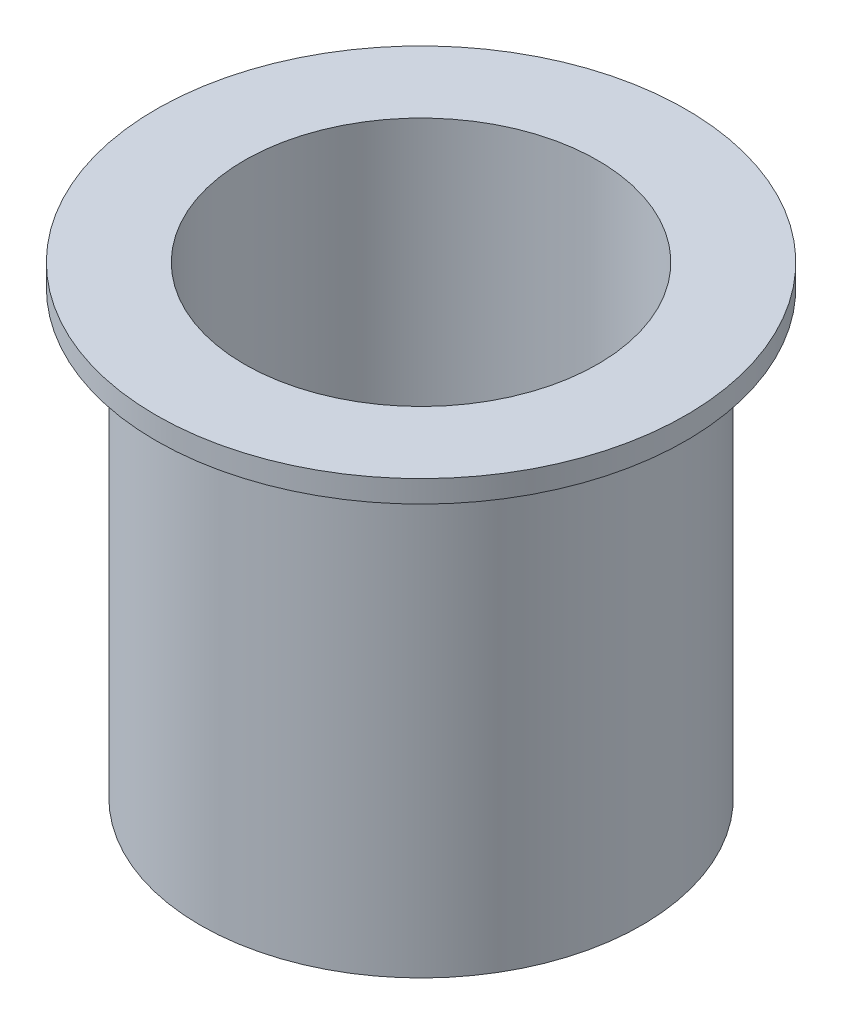
ISO-10303-21;
HEADER;
FILE_DESCRIPTION(('STEP AP214'),'2;1');
FILE_NAME('part.step','',(''),(''),'','','');
FILE_SCHEMA(('AUTOMOTIVE_DESIGN { 1 0 10303 214 1 1 1 1 }'));
ENDSEC;
DATA;
#1=APPLICATION_CONTEXT('core data for automotive mechanical design processes');
#2=APPLICATION_PROTOCOL_DEFINITION('international standard','automotive_design',2000,#1);
#3=PRODUCT_CONTEXT('',#1,'mechanical');
#4=PRODUCT('Part','Part','',(#3));
#5=PRODUCT_RELATED_PRODUCT_CATEGORY('part','',(#4));
#6=PRODUCT_DEFINITION_FORMATION('','',#4);
#7=PRODUCT_DEFINITION_CONTEXT('part definition',#1,'design');
#8=PRODUCT_DEFINITION('design','',#6,#7);
#9=PRODUCT_DEFINITION_SHAPE('','',#8);
#10=(LENGTH_UNIT() NAMED_UNIT(*) SI_UNIT(.MILLI.,.METRE.));
#11=(NAMED_UNIT(*) PLANE_ANGLE_UNIT() SI_UNIT($,.RADIAN.));
#12=(NAMED_UNIT(*) SI_UNIT($,.STERADIAN.) SOLID_ANGLE_UNIT());
#13=UNCERTAINTY_MEASURE_WITH_UNIT(LENGTH_MEASURE(1.E-05),#10,'distance_accuracy_value','');
#14=(GEOMETRIC_REPRESENTATION_CONTEXT(3) GLOBAL_UNCERTAINTY_ASSIGNED_CONTEXT((#13)) GLOBAL_UNIT_ASSIGNED_CONTEXT((#10,
#11,#12)) REPRESENTATION_CONTEXT('',''));
#15=CARTESIAN_POINT('',(0.,0.,0.));
#16=DIRECTION('',(0.,0.,1.));
#17=DIRECTION('',(1.,0.,0.));
#18=AXIS2_PLACEMENT_3D('',#15,#16,#17);
#19=CARTESIAN_POINT('',(0.,-20.,0.));
#20=DIRECTION('',(0.,1.,0.));
#21=DIRECTION('',(0.,0.,1.));
#22=AXIS2_PLACEMENT_3D('',#19,#20,#21);
#23=CYLINDRICAL_SURFACE('',#22,10.);
#24=CARTESIAN_POINT('',(0.,-20.,0.));
#25=DIRECTION('',(0.,1.,0.));
#26=DIRECTION('',(0.,0.,1.));
#27=AXIS2_PLACEMENT_3D('',#24,#25,#26);
#28=CIRCLE('',#27,10.);
#29=CARTESIAN_POINT('',(0.,-20.,10.));
#30=VERTEX_POINT('',#29);
#31=EDGE_CURVE('E11',#30,#30,#28,.T.);
#32=ORIENTED_EDGE('',*,*,#31,.T.);
#33=EDGE_LOOP('',(#32));
#34=FACE_BOUND('',#33,.T.);
#35=CARTESIAN_POINT('',(0.,0.,0.));
#36=DIRECTION('',(0.,1.,0.));
#37=DIRECTION('',(0.,0.,1.));
#38=AXIS2_PLACEMENT_3D('',#35,#36,#37);
#39=CIRCLE('',#38,10.);
#40=CARTESIAN_POINT('',(0.,0.,10.));
#41=VERTEX_POINT('',#40);
#42=EDGE_CURVE('E42',#41,#41,#39,.T.);
#43=ORIENTED_EDGE('',*,*,#42,.F.);
#44=EDGE_LOOP('',(#43));
#45=FACE_BOUND('',#44,.T.);
#46=ADVANCED_FACE('F39',(#34,#45),#23,.T.);
#47=CARTESIAN_POINT('',(0.,-20.,0.));
#48=DIRECTION('',(0.,1.,0.));
#49=DIRECTION('',(0.,0.,1.));
#50=AXIS2_PLACEMENT_3D('',#47,#48,#49);
#51=PLANE('',#50);
#52=CARTESIAN_POINT('',(0.,-20.,0.));
#53=DIRECTION('',(0.,1.,0.));
#54=DIRECTION('',(0.,0.,1.));
#55=AXIS2_PLACEMENT_3D('',#52,#53,#54);
#56=CIRCLE('',#55,8.);
#57=CARTESIAN_POINT('',(0.,-20.,8.));
#58=VERTEX_POINT('',#57);
#59=EDGE_CURVE('E49',#58,#58,#56,.T.);
#60=ORIENTED_EDGE('',*,*,#59,.T.);
#61=EDGE_LOOP('',(#60));
#62=FACE_BOUND('',#61,.T.);
#63=ORIENTED_EDGE('',*,*,#31,.F.);
#64=EDGE_LOOP('',(#63));
#65=FACE_BOUND('',#64,.T.);
#66=ADVANCED_FACE('F77',(#62,#65),#51,.F.);
#67=CARTESIAN_POINT('',(0.,-20.,0.));
#68=DIRECTION('',(0.,1.,0.));
#69=DIRECTION('',(0.,0.,1.));
#70=AXIS2_PLACEMENT_3D('',#67,#68,#69);
#71=CYLINDRICAL_SURFACE('',#70,8.);
#72=ORIENTED_EDGE('',*,*,#59,.F.);
#73=EDGE_LOOP('',(#72));
#74=FACE_BOUND('',#73,.T.);
#75=CARTESIAN_POINT('',(0.,1.,0.));
#76=DIRECTION('',(0.,1.,0.));
#77=DIRECTION('',(0.,0.,1.));
#78=AXIS2_PLACEMENT_3D('',#75,#76,#77);
#79=CIRCLE('',#78,8.);
#80=CARTESIAN_POINT('',(0.,1.,8.));
#81=VERTEX_POINT('',#80);
#82=EDGE_CURVE('E57',#81,#81,#79,.T.);
#83=ORIENTED_EDGE('',*,*,#82,.T.);
#84=EDGE_LOOP('',(#83));
#85=FACE_BOUND('',#84,.T.);
#86=ADVANCED_FACE('F63',(#74,#85),#71,.F.);
#87=CARTESIAN_POINT('',(0.,1.,0.));
#88=DIRECTION('',(0.,1.,0.));
#89=DIRECTION('',(0.,0.,1.));
#90=AXIS2_PLACEMENT_3D('',#87,#88,#89);
#91=PLANE('',#90);
#92=CARTESIAN_POINT('',(0.,1.,0.));
#93=DIRECTION('',(0.,1.,0.));
#94=DIRECTION('',(0.,0.,1.));
#95=AXIS2_PLACEMENT_3D('',#92,#93,#94);
#96=CIRCLE('',#95,12.);
#97=CARTESIAN_POINT('',(0.,1.,12.));
#98=VERTEX_POINT('',#97);
#99=EDGE_CURVE('E53',#98,#98,#96,.T.);
#100=ORIENTED_EDGE('',*,*,#99,.T.);
#101=EDGE_LOOP('',(#100));
#102=FACE_BOUND('',#101,.T.);
#103=ORIENTED_EDGE('',*,*,#82,.F.);
#104=EDGE_LOOP('',(#103));
#105=FACE_BOUND('',#104,.T.);
#106=ADVANCED_FACE('F65',(#102,#105),#91,.T.);
#107=CARTESIAN_POINT('',(0.,0.,0.));
#108=DIRECTION('',(0.,1.,0.));
#109=DIRECTION('',(0.,0.,1.));
#110=AXIS2_PLACEMENT_3D('',#107,#108,#109);
#111=PLANE('',#110);
#112=ORIENTED_EDGE('',*,*,#42,.T.);
#113=EDGE_LOOP('',(#112));
#114=FACE_BOUND('',#113,.T.);
#115=CARTESIAN_POINT('',(0.,0.,0.));
#116=DIRECTION('',(0.,1.,0.));
#117=DIRECTION('',(0.,0.,1.));
#118=AXIS2_PLACEMENT_3D('',#115,#116,#117);
#119=CIRCLE('',#118,12.);
#120=CARTESIAN_POINT('',(0.,0.,12.));
#121=VERTEX_POINT('',#120);
#122=EDGE_CURVE('E54',#121,#121,#119,.T.);
#123=ORIENTED_EDGE('',*,*,#122,.F.);
#124=EDGE_LOOP('',(#123));
#125=FACE_BOUND('',#124,.T.);
#126=ADVANCED_FACE('F67',(#114,#125),#111,.F.);
#127=CARTESIAN_POINT('',(0.,1.,0.));
#128=DIRECTION('',(0.,-1.,0.));
#129=DIRECTION('',(0.,0.,-1.));
#130=AXIS2_PLACEMENT_3D('',#127,#128,#129);
#131=CYLINDRICAL_SURFACE('',#130,12.);
#132=ORIENTED_EDGE('',*,*,#99,.F.);
#133=EDGE_LOOP('',(#132));
#134=FACE_BOUND('',#133,.T.);
#135=ORIENTED_EDGE('',*,*,#122,.T.);
#136=EDGE_LOOP('',(#135));
#137=FACE_BOUND('',#136,.T.);
#138=ADVANCED_FACE('F74',(#134,#137),#131,.T.);
#139=CLOSED_SHELL('',(#46,#66,#86,#106,#126,#138));
#140=MANIFOLD_SOLID_BREP('B2',#139);
#141=ADVANCED_BREP_SHAPE_REPRESENTATION('',(#18,#140),#14);
#142=SHAPE_DEFINITION_REPRESENTATION(#9,#141);
ENDSEC;
END-ISO-10303-21;
